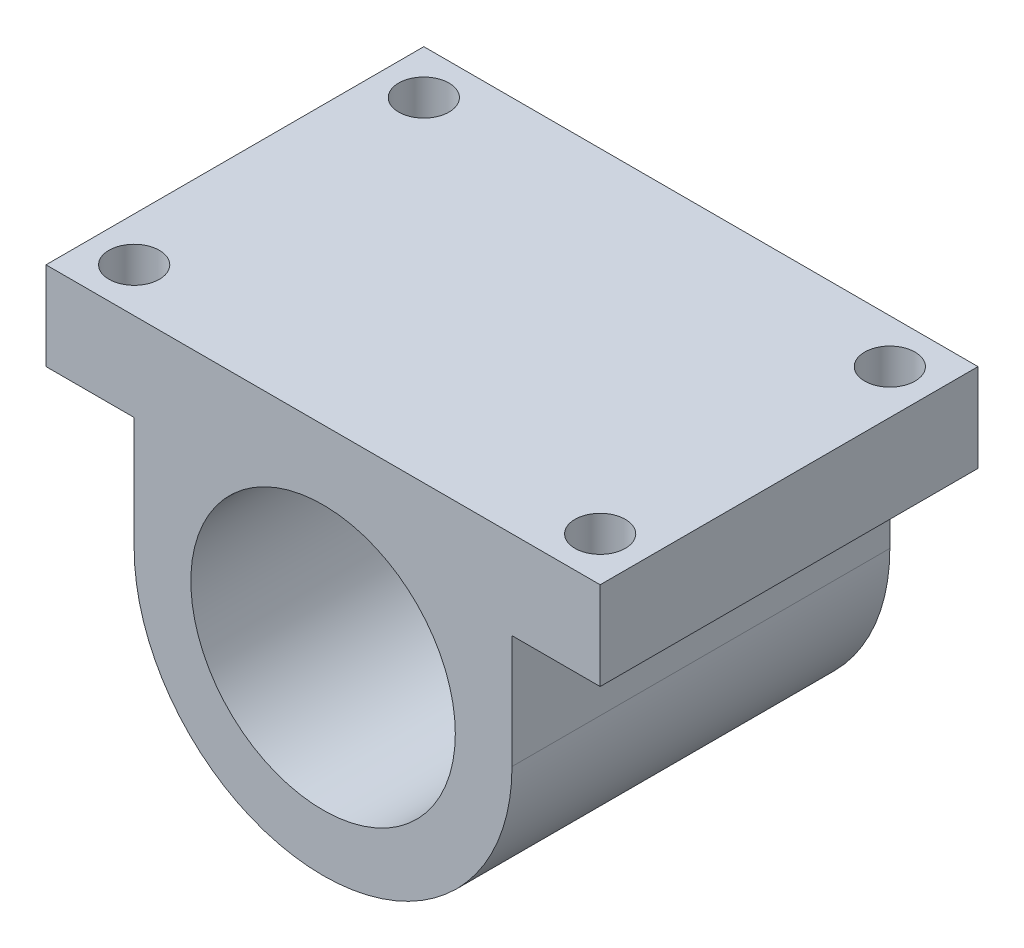
ISO-10303-21;
HEADER;
FILE_DESCRIPTION(('STEP AP214'),'2;1');
FILE_NAME('part.step','',(''),(''),'','','');
FILE_SCHEMA(('AUTOMOTIVE_DESIGN { 1 0 10303 214 1 1 1 1 }'));
ENDSEC;
DATA;
#1=APPLICATION_CONTEXT('core data for automotive mechanical design processes');
#2=APPLICATION_PROTOCOL_DEFINITION('international standard','automotive_design',2000,#1);
#3=PRODUCT_CONTEXT('',#1,'mechanical');
#4=PRODUCT('Part','Part','',(#3));
#5=PRODUCT_RELATED_PRODUCT_CATEGORY('part','',(#4));
#6=PRODUCT_DEFINITION_FORMATION('','',#4);
#7=PRODUCT_DEFINITION_CONTEXT('part definition',#1,'design');
#8=PRODUCT_DEFINITION('design','',#6,#7);
#9=PRODUCT_DEFINITION_SHAPE('','',#8);
#10=(LENGTH_UNIT() NAMED_UNIT(*) SI_UNIT(.MILLI.,.METRE.));
#11=(NAMED_UNIT(*) PLANE_ANGLE_UNIT() SI_UNIT($,.RADIAN.));
#12=(NAMED_UNIT(*) SI_UNIT($,.STERADIAN.) SOLID_ANGLE_UNIT());
#13=UNCERTAINTY_MEASURE_WITH_UNIT(LENGTH_MEASURE(1.E-05),#10,'distance_accuracy_value','');
#14=(GEOMETRIC_REPRESENTATION_CONTEXT(3) GLOBAL_UNCERTAINTY_ASSIGNED_CONTEXT((#13)) GLOBAL_UNIT_ASSIGNED_CONTEXT((#10,
#11,#12)) REPRESENTATION_CONTEXT('',''));
#15=CARTESIAN_POINT('',(0.,0.,0.));
#16=DIRECTION('',(0.,0.,1.));
#17=DIRECTION('',(1.,0.,0.));
#18=AXIS2_PLACEMENT_3D('',#15,#16,#17);
#19=CARTESIAN_POINT('',(-15.,31.,30.));
#20=DIRECTION('',(1.,0.,0.));
#21=DIRECTION('',(0.,0.,-1.));
#22=AXIS2_PLACEMENT_3D('',#19,#20,#21);
#23=PLANE('',#22);
#24=DIRECTION('',(0.,0.,1.));
#25=VECTOR('',#24,1.);
#26=CARTESIAN_POINT('',(-15.,24.,0.));
#27=LINE('',#26,#25);
#28=CARTESIAN_POINT('',(-15.,24.,0.));
#29=VERTEX_POINT('',#28);
#30=CARTESIAN_POINT('',(-15.,24.,30.));
#31=VERTEX_POINT('',#30);
#32=EDGE_CURVE('E53',#29,#31,#27,.T.);
#33=ORIENTED_EDGE('',*,*,#32,.F.);
#34=DIRECTION('',(0.,-1.,0.));
#35=VECTOR('',#34,1.);
#36=CARTESIAN_POINT('',(-15.,31.,0.));
#37=LINE('',#36,#35);
#38=CARTESIAN_POINT('',(-15.,15.,0.));
#39=VERTEX_POINT('',#38);
#40=EDGE_CURVE('E161',#29,#39,#37,.T.);
#41=ORIENTED_EDGE('',*,*,#40,.T.);
#42=DIRECTION('',(0.,0.,-1.));
#43=VECTOR('',#42,1.);
#44=CARTESIAN_POINT('',(-15.,15.,30.));
#45=LINE('',#44,#43);
#46=CARTESIAN_POINT('',(-15.,15.,30.));
#47=VERTEX_POINT('',#46);
#48=EDGE_CURVE('E42',#39,#47,#45,.F.);
#49=ORIENTED_EDGE('',*,*,#48,.T.);
#50=DIRECTION('',(0.,-1.,0.));
#51=VECTOR('',#50,1.);
#52=CARTESIAN_POINT('',(-15.,31.,30.));
#53=LINE('',#52,#51);
#54=EDGE_CURVE('E49',#31,#47,#53,.T.);
#55=ORIENTED_EDGE('',*,*,#54,.F.);
#56=EDGE_LOOP('',(#33,#41,#49,#55));
#57=FACE_BOUND('',#56,.T.);
#58=ADVANCED_FACE('F34',(#57),#23,.F.);
#59=CARTESIAN_POINT('',(15.,0.,30.));
#60=DIRECTION('',(-1.,0.,0.));
#61=DIRECTION('',(0.,0.,1.));
#62=AXIS2_PLACEMENT_3D('',#59,#60,#61);
#63=PLANE('',#62);
#64=DIRECTION('',(0.,0.,-1.));
#65=VECTOR('',#64,1.);
#66=CARTESIAN_POINT('',(15.,24.,0.));
#67=LINE('',#66,#65);
#68=CARTESIAN_POINT('',(15.,24.,30.));
#69=VERTEX_POINT('',#68);
#70=CARTESIAN_POINT('',(15.,24.,0.));
#71=VERTEX_POINT('',#70);
#72=EDGE_CURVE('E142',#69,#71,#67,.T.);
#73=ORIENTED_EDGE('',*,*,#72,.F.);
#74=DIRECTION('',(0.,1.,0.));
#75=VECTOR('',#74,1.);
#76=CARTESIAN_POINT('',(15.,0.,30.));
#77=LINE('',#76,#75);
#78=CARTESIAN_POINT('',(15.,15.,30.));
#79=VERTEX_POINT('',#78);
#80=EDGE_CURVE('E115',#79,#69,#77,.T.);
#81=ORIENTED_EDGE('',*,*,#80,.F.);
#82=DIRECTION('',(0.,0.,-1.));
#83=VECTOR('',#82,1.);
#84=CARTESIAN_POINT('',(15.,15.,30.));
#85=LINE('',#84,#83);
#86=CARTESIAN_POINT('',(15.,15.,0.));
#87=VERTEX_POINT('',#86);
#88=EDGE_CURVE('E114',#79,#87,#85,.T.);
#89=ORIENTED_EDGE('',*,*,#88,.T.);
#90=DIRECTION('',(0.,1.,0.));
#91=VECTOR('',#90,1.);
#92=CARTESIAN_POINT('',(15.,0.,0.));
#93=LINE('',#92,#91);
#94=EDGE_CURVE('E168',#87,#71,#93,.T.);
#95=ORIENTED_EDGE('',*,*,#94,.T.);
#96=EDGE_LOOP('',(#73,#81,#89,#95));
#97=FACE_BOUND('',#96,.T.);
#98=ADVANCED_FACE('F196',(#97),#63,.F.);
#99=CARTESIAN_POINT('',(0.,0.,30.));
#100=DIRECTION('',(0.,0.,1.));
#101=DIRECTION('',(1.,0.,0.));
#102=AXIS2_PLACEMENT_3D('',#99,#100,#101);
#103=PLANE('',#102);
#104=DIRECTION('',(-1.,0.,0.));
#105=VECTOR('',#104,1.);
#106=CARTESIAN_POINT('',(15.,31.,30.));
#107=LINE('',#106,#105);
#108=CARTESIAN_POINT('',(22.,31.,30.));
#109=VERTEX_POINT('',#108);
#110=CARTESIAN_POINT('',(-22.,31.,30.));
#111=VERTEX_POINT('',#110);
#112=EDGE_CURVE('E102',#109,#111,#107,.T.);
#113=ORIENTED_EDGE('',*,*,#112,.T.);
#114=DIRECTION('',(0.,1.,0.));
#115=VECTOR('',#114,1.);
#116=CARTESIAN_POINT('',(-22.,24.,30.));
#117=LINE('',#116,#115);
#118=CARTESIAN_POINT('',(-22.,24.,30.));
#119=VERTEX_POINT('',#118);
#120=EDGE_CURVE('E108',#119,#111,#117,.T.);
#121=ORIENTED_EDGE('',*,*,#120,.F.);
#122=DIRECTION('',(1.,0.,0.));
#123=VECTOR('',#122,1.);
#124=CARTESIAN_POINT('',(-22.,24.,30.));
#125=LINE('',#124,#123);
#126=EDGE_CURVE('E136',#119,#31,#125,.T.);
#127=ORIENTED_EDGE('',*,*,#126,.T.);
#128=ORIENTED_EDGE('',*,*,#54,.T.);
#129=CARTESIAN_POINT('',(0.,15.,30.));
#130=DIRECTION('',(0.,0.,1.));
#131=DIRECTION('',(1.,0.,0.));
#132=AXIS2_PLACEMENT_3D('',#129,#130,#131);
#133=CIRCLE('',#132,15.);
#134=CARTESIAN_POINT('',(0.,0.,30.));
#135=VERTEX_POINT('',#134);
#136=EDGE_CURVE('E11',#47,#135,#133,.T.);
#137=ORIENTED_EDGE('',*,*,#136,.T.);
#138=CARTESIAN_POINT('',(0.,15.,30.));
#139=DIRECTION('',(0.,0.,1.));
#140=DIRECTION('',(1.,0.,0.));
#141=AXIS2_PLACEMENT_3D('',#138,#139,#140);
#142=CIRCLE('',#141,15.);
#143=EDGE_CURVE('E180',#135,#79,#142,.T.);
#144=ORIENTED_EDGE('',*,*,#143,.T.);
#145=ORIENTED_EDGE('',*,*,#80,.T.);
#146=DIRECTION('',(-1.,0.,0.));
#147=VECTOR('',#146,1.);
#148=CARTESIAN_POINT('',(22.,24.,30.));
#149=LINE('',#148,#147);
#150=CARTESIAN_POINT('',(22.,24.,30.));
#151=VERTEX_POINT('',#150);
#152=EDGE_CURVE('E155',#151,#69,#149,.T.);
#153=ORIENTED_EDGE('',*,*,#152,.F.);
#154=DIRECTION('',(0.,-1.,0.));
#155=VECTOR('',#154,1.);
#156=CARTESIAN_POINT('',(22.,24.,30.));
#157=LINE('',#156,#155);
#158=EDGE_CURVE('E110',#109,#151,#157,.T.);
#159=ORIENTED_EDGE('',*,*,#158,.F.);
#160=EDGE_LOOP('',(#113,#121,#127,#128,#137,#144,#145,#153,#159));
#161=FACE_BOUND('',#160,.T.);
#162=CARTESIAN_POINT('',(0.,15.,30.));
#163=DIRECTION('',(0.,0.,1.));
#164=DIRECTION('',(1.,0.,0.));
#165=AXIS2_PLACEMENT_3D('',#162,#163,#164);
#166=CIRCLE('',#165,10.5);
#167=CARTESIAN_POINT('',(10.5,15.,30.));
#168=VERTEX_POINT('',#167);
#169=EDGE_CURVE('E158',#168,#168,#166,.T.);
#170=ORIENTED_EDGE('',*,*,#169,.F.);
#171=EDGE_LOOP('',(#170));
#172=FACE_BOUND('',#171,.T.);
#173=ADVANCED_FACE('F104',(#161,#172),#103,.T.);
#174=CARTESIAN_POINT('',(0.,0.,0.));
#175=DIRECTION('',(0.,0.,1.));
#176=DIRECTION('',(1.,0.,0.));
#177=AXIS2_PLACEMENT_3D('',#174,#175,#176);
#178=PLANE('',#177);
#179=CARTESIAN_POINT('',(0.,15.,0.));
#180=DIRECTION('',(0.,0.,1.));
#181=DIRECTION('',(1.,0.,0.));
#182=AXIS2_PLACEMENT_3D('',#179,#180,#181);
#183=CIRCLE('',#182,15.);
#184=CARTESIAN_POINT('',(0.,0.,0.));
#185=VERTEX_POINT('',#184);
#186=EDGE_CURVE('E174',#87,#185,#183,.F.);
#187=ORIENTED_EDGE('',*,*,#186,.T.);
#188=CARTESIAN_POINT('',(0.,15.,0.));
#189=DIRECTION('',(0.,0.,1.));
#190=DIRECTION('',(1.,0.,0.));
#191=AXIS2_PLACEMENT_3D('',#188,#189,#190);
#192=CIRCLE('',#191,15.);
#193=EDGE_CURVE('E182',#185,#39,#192,.F.);
#194=ORIENTED_EDGE('',*,*,#193,.T.);
#195=ORIENTED_EDGE('',*,*,#40,.F.);
#196=DIRECTION('',(1.,0.,0.));
#197=VECTOR('',#196,1.);
#198=CARTESIAN_POINT('',(-22.,24.,0.));
#199=LINE('',#198,#197);
#200=CARTESIAN_POINT('',(-22.,24.,0.));
#201=VERTEX_POINT('',#200);
#202=EDGE_CURVE('E139',#201,#29,#199,.T.);
#203=ORIENTED_EDGE('',*,*,#202,.F.);
#204=DIRECTION('',(0.,-1.,0.));
#205=VECTOR('',#204,1.);
#206=CARTESIAN_POINT('',(-22.,31.,0.));
#207=LINE('',#206,#205);
#208=CARTESIAN_POINT('',(-22.,31.,0.));
#209=VERTEX_POINT('',#208);
#210=EDGE_CURVE('E123',#209,#201,#207,.T.);
#211=ORIENTED_EDGE('',*,*,#210,.F.);
#212=DIRECTION('',(-1.,0.,0.));
#213=VECTOR('',#212,1.);
#214=CARTESIAN_POINT('',(15.,31.,0.));
#215=LINE('',#214,#213);
#216=CARTESIAN_POINT('',(22.,31.,0.));
#217=VERTEX_POINT('',#216);
#218=EDGE_CURVE('E120',#217,#209,#215,.T.);
#219=ORIENTED_EDGE('',*,*,#218,.F.);
#220=DIRECTION('',(0.,1.,0.));
#221=VECTOR('',#220,1.);
#222=CARTESIAN_POINT('',(22.,31.,0.));
#223=LINE('',#222,#221);
#224=CARTESIAN_POINT('',(22.,24.,0.));
#225=VERTEX_POINT('',#224);
#226=EDGE_CURVE('E148',#225,#217,#223,.T.);
#227=ORIENTED_EDGE('',*,*,#226,.F.);
#228=DIRECTION('',(-1.,0.,0.));
#229=VECTOR('',#228,1.);
#230=CARTESIAN_POINT('',(22.,24.,0.));
#231=LINE('',#230,#229);
#232=EDGE_CURVE('E151',#225,#71,#231,.T.);
#233=ORIENTED_EDGE('',*,*,#232,.T.);
#234=ORIENTED_EDGE('',*,*,#94,.F.);
#235=EDGE_LOOP('',(#187,#194,#195,#203,#211,#219,#227,#233,#234));
#236=FACE_BOUND('',#235,.T.);
#237=CARTESIAN_POINT('',(0.,15.,0.));
#238=DIRECTION('',(0.,0.,1.));
#239=DIRECTION('',(1.,0.,0.));
#240=AXIS2_PLACEMENT_3D('',#237,#238,#239);
#241=CIRCLE('',#240,10.5);
#242=CARTESIAN_POINT('',(10.5,15.,0.));
#243=VERTEX_POINT('',#242);
#244=EDGE_CURVE('E157',#243,#243,#241,.T.);
#245=ORIENTED_EDGE('',*,*,#244,.T.);
#246=EDGE_LOOP('',(#245));
#247=FACE_BOUND('',#246,.T.);
#248=ADVANCED_FACE('F198',(#236,#247),#178,.F.);
#249=CARTESIAN_POINT('',(15.,31.,30.));
#250=DIRECTION('',(0.,-1.,0.));
#251=DIRECTION('',(0.,0.,-1.));
#252=AXIS2_PLACEMENT_3D('',#249,#250,#251);
#253=PLANE('',#252);
#254=CARTESIAN_POINT('',(18.5,31.,26.5));
#255=DIRECTION('',(0.,1.,0.));
#256=DIRECTION('',(0.,0.,1.));
#257=AXIS2_PLACEMENT_3D('',#254,#255,#256);
#258=CIRCLE('',#257,2.);
#259=CARTESIAN_POINT('',(18.5,31.,28.5));
#260=VERTEX_POINT('',#259);
#261=EDGE_CURVE('E320',#260,#260,#258,.T.);
#262=ORIENTED_EDGE('',*,*,#261,.F.);
#263=EDGE_LOOP('',(#262));
#264=FACE_BOUND('',#263,.T.);
#265=CARTESIAN_POINT('',(-18.5,31.,26.5));
#266=DIRECTION('',(0.,1.,0.));
#267=DIRECTION('',(0.,0.,1.));
#268=AXIS2_PLACEMENT_3D('',#265,#266,#267);
#269=CIRCLE('',#268,2.);
#270=CARTESIAN_POINT('',(-18.5,31.,28.5));
#271=VERTEX_POINT('',#270);
#272=EDGE_CURVE('E326',#271,#271,#269,.T.);
#273=ORIENTED_EDGE('',*,*,#272,.F.);
#274=EDGE_LOOP('',(#273));
#275=FACE_BOUND('',#274,.T.);
#276=CARTESIAN_POINT('',(-18.5,31.,3.5));
#277=DIRECTION('',(0.,1.,0.));
#278=DIRECTION('',(0.,0.,1.));
#279=AXIS2_PLACEMENT_3D('',#276,#277,#278);
#280=CIRCLE('',#279,2.);
#281=CARTESIAN_POINT('',(-18.5,31.,5.5));
#282=VERTEX_POINT('',#281);
#283=EDGE_CURVE('E332',#282,#282,#280,.T.);
#284=ORIENTED_EDGE('',*,*,#283,.F.);
#285=EDGE_LOOP('',(#284));
#286=FACE_BOUND('',#285,.T.);
#287=CARTESIAN_POINT('',(18.5,31.,3.5));
#288=DIRECTION('',(0.,1.,0.));
#289=DIRECTION('',(0.,0.,1.));
#290=AXIS2_PLACEMENT_3D('',#287,#288,#289);
#291=CIRCLE('',#290,2.);
#292=CARTESIAN_POINT('',(18.5,31.,5.50000000000001));
#293=VERTEX_POINT('',#292);
#294=EDGE_CURVE('E323',#293,#293,#291,.T.);
#295=ORIENTED_EDGE('',*,*,#294,.F.);
#296=EDGE_LOOP('',(#295));
#297=FACE_BOUND('',#296,.T.);
#298=ORIENTED_EDGE('',*,*,#218,.T.);
#299=DIRECTION('',(0.,0.,-1.));
#300=VECTOR('',#299,1.);
#301=CARTESIAN_POINT('',(-22.,31.,30.));
#302=LINE('',#301,#300);
#303=EDGE_CURVE('E118',#111,#209,#302,.T.);
#304=ORIENTED_EDGE('',*,*,#303,.F.);
#305=ORIENTED_EDGE('',*,*,#112,.F.);
#306=DIRECTION('',(0.,0.,1.));
#307=VECTOR('',#306,1.);
#308=CARTESIAN_POINT('',(22.,31.,30.));
#309=LINE('',#308,#307);
#310=EDGE_CURVE('E143',#217,#109,#309,.T.);
#311=ORIENTED_EDGE('',*,*,#310,.F.);
#312=EDGE_LOOP('',(#298,#304,#305,#311));
#313=FACE_BOUND('',#312,.T.);
#314=ADVANCED_FACE('F119',(#264,#275,#286,#297,#313),#253,.F.);
#315=CARTESIAN_POINT('',(0.,15.,30.));
#316=DIRECTION('',(0.,0.,-1.));
#317=DIRECTION('',(-1.,0.,0.));
#318=AXIS2_PLACEMENT_3D('',#315,#316,#317);
#319=CYLINDRICAL_SURFACE('',#318,10.5);
#320=ORIENTED_EDGE('',*,*,#169,.T.);
#321=EDGE_LOOP('',(#320));
#322=FACE_BOUND('',#321,.T.);
#323=ORIENTED_EDGE('',*,*,#244,.F.);
#324=EDGE_LOOP('',(#323));
#325=FACE_BOUND('',#324,.T.);
#326=ADVANCED_FACE('F226',(#322,#325),#319,.F.);
#327=CARTESIAN_POINT('',(0.,15.,30.));
#328=DIRECTION('',(0.,0.,-1.));
#329=DIRECTION('',(-1.,0.,0.));
#330=AXIS2_PLACEMENT_3D('',#327,#328,#329);
#331=CYLINDRICAL_SURFACE('',#330,15.);
#332=ORIENTED_EDGE('',*,*,#143,.F.);
#333=DIRECTION('',(0.,0.,-1.));
#334=VECTOR('',#333,1.);
#335=CARTESIAN_POINT('',(0.,0.,30.));
#336=LINE('',#335,#334);
#337=EDGE_CURVE('E177',#185,#135,#336,.F.);
#338=ORIENTED_EDGE('',*,*,#337,.F.);
#339=ORIENTED_EDGE('',*,*,#186,.F.);
#340=ORIENTED_EDGE('',*,*,#88,.F.);
#341=EDGE_LOOP('',(#332,#338,#339,#340));
#342=FACE_BOUND('',#341,.T.);
#343=ADVANCED_FACE('F192',(#342),#331,.T.);
#344=CARTESIAN_POINT('',(0.,15.,30.));
#345=DIRECTION('',(0.,0.,-1.));
#346=DIRECTION('',(-1.,0.,0.));
#347=AXIS2_PLACEMENT_3D('',#344,#345,#346);
#348=CYLINDRICAL_SURFACE('',#347,15.);
#349=ORIENTED_EDGE('',*,*,#136,.F.);
#350=ORIENTED_EDGE('',*,*,#48,.F.);
#351=ORIENTED_EDGE('',*,*,#193,.F.);
#352=ORIENTED_EDGE('',*,*,#337,.T.);
#353=EDGE_LOOP('',(#349,#350,#351,#352));
#354=FACE_BOUND('',#353,.T.);
#355=ADVANCED_FACE('F36',(#354),#348,.T.);
#356=CARTESIAN_POINT('',(22.,24.,0.));
#357=DIRECTION('',(0.,1.,0.));
#358=DIRECTION('',(0.,0.,1.));
#359=AXIS2_PLACEMENT_3D('',#356,#357,#358);
#360=PLANE('',#359);
#361=CARTESIAN_POINT('',(18.5,24.,26.5));
#362=DIRECTION('',(0.,1.,0.));
#363=DIRECTION('',(0.,0.,1.));
#364=AXIS2_PLACEMENT_3D('',#361,#362,#363);
#365=CIRCLE('',#364,2.);
#366=CARTESIAN_POINT('',(18.5,24.,28.5));
#367=VERTEX_POINT('',#366);
#368=EDGE_CURVE('E317',#367,#367,#365,.F.);
#369=ORIENTED_EDGE('',*,*,#368,.F.);
#370=EDGE_LOOP('',(#369));
#371=FACE_BOUND('',#370,.T.);
#372=CARTESIAN_POINT('',(18.5,24.,3.5));
#373=DIRECTION('',(0.,1.,0.));
#374=DIRECTION('',(0.,0.,1.));
#375=AXIS2_PLACEMENT_3D('',#372,#373,#374);
#376=CIRCLE('',#375,2.);
#377=CARTESIAN_POINT('',(18.5,24.,5.50000000000001));
#378=VERTEX_POINT('',#377);
#379=EDGE_CURVE('E130',#378,#378,#376,.F.);
#380=ORIENTED_EDGE('',*,*,#379,.F.);
#381=EDGE_LOOP('',(#380));
#382=FACE_BOUND('',#381,.T.);
#383=ORIENTED_EDGE('',*,*,#72,.T.);
#384=ORIENTED_EDGE('',*,*,#232,.F.);
#385=DIRECTION('',(0.,0.,-1.));
#386=VECTOR('',#385,1.);
#387=CARTESIAN_POINT('',(22.,24.,0.));
#388=LINE('',#387,#386);
#389=EDGE_CURVE('E146',#151,#225,#388,.T.);
#390=ORIENTED_EDGE('',*,*,#389,.F.);
#391=ORIENTED_EDGE('',*,*,#152,.T.);
#392=EDGE_LOOP('',(#383,#384,#390,#391));
#393=FACE_BOUND('',#392,.T.);
#394=ADVANCED_FACE('F204',(#371,#382,#393),#360,.F.);
#395=CARTESIAN_POINT('',(22.,0.,0.));
#396=DIRECTION('',(-1.,0.,0.));
#397=DIRECTION('',(0.,0.,1.));
#398=AXIS2_PLACEMENT_3D('',#395,#396,#397);
#399=PLANE('',#398);
#400=ORIENTED_EDGE('',*,*,#310,.T.);
#401=ORIENTED_EDGE('',*,*,#158,.T.);
#402=ORIENTED_EDGE('',*,*,#389,.T.);
#403=ORIENTED_EDGE('',*,*,#226,.T.);
#404=EDGE_LOOP('',(#400,#401,#402,#403));
#405=FACE_BOUND('',#404,.T.);
#406=ADVANCED_FACE('F206',(#405),#399,.F.);
#407=CARTESIAN_POINT('',(-22.,24.,0.));
#408=DIRECTION('',(0.,1.,0.));
#409=DIRECTION('',(0.,0.,1.));
#410=AXIS2_PLACEMENT_3D('',#407,#408,#409);
#411=PLANE('',#410);
#412=CARTESIAN_POINT('',(-18.5,24.,26.5));
#413=DIRECTION('',(0.,1.,0.));
#414=DIRECTION('',(0.,0.,1.));
#415=AXIS2_PLACEMENT_3D('',#412,#413,#414);
#416=CIRCLE('',#415,2.);
#417=CARTESIAN_POINT('',(-18.5,24.,28.5));
#418=VERTEX_POINT('',#417);
#419=EDGE_CURVE('E321',#418,#418,#416,.F.);
#420=ORIENTED_EDGE('',*,*,#419,.F.);
#421=EDGE_LOOP('',(#420));
#422=FACE_BOUND('',#421,.T.);
#423=CARTESIAN_POINT('',(-18.5,24.,3.5));
#424=DIRECTION('',(0.,1.,0.));
#425=DIRECTION('',(0.,0.,1.));
#426=AXIS2_PLACEMENT_3D('',#423,#424,#425);
#427=CIRCLE('',#426,2.);
#428=CARTESIAN_POINT('',(-18.5,24.,5.5));
#429=VERTEX_POINT('',#428);
#430=EDGE_CURVE('E330',#429,#429,#427,.F.);
#431=ORIENTED_EDGE('',*,*,#430,.F.);
#432=EDGE_LOOP('',(#431));
#433=FACE_BOUND('',#432,.T.);
#434=ORIENTED_EDGE('',*,*,#32,.T.);
#435=ORIENTED_EDGE('',*,*,#126,.F.);
#436=DIRECTION('',(0.,0.,1.));
#437=VECTOR('',#436,1.);
#438=CARTESIAN_POINT('',(-22.,24.,0.));
#439=LINE('',#438,#437);
#440=EDGE_CURVE('E127',#201,#119,#439,.T.);
#441=ORIENTED_EDGE('',*,*,#440,.F.);
#442=ORIENTED_EDGE('',*,*,#202,.T.);
#443=EDGE_LOOP('',(#434,#435,#441,#442));
#444=FACE_BOUND('',#443,.T.);
#445=ADVANCED_FACE('F208',(#422,#433,#444),#411,.F.);
#446=CARTESIAN_POINT('',(-22.,0.,0.));
#447=DIRECTION('',(-1.,0.,0.));
#448=DIRECTION('',(0.,0.,1.));
#449=AXIS2_PLACEMENT_3D('',#446,#447,#448);
#450=PLANE('',#449);
#451=ORIENTED_EDGE('',*,*,#120,.T.);
#452=ORIENTED_EDGE('',*,*,#303,.T.);
#453=ORIENTED_EDGE('',*,*,#210,.T.);
#454=ORIENTED_EDGE('',*,*,#440,.T.);
#455=EDGE_LOOP('',(#451,#452,#453,#454));
#456=FACE_BOUND('',#455,.T.);
#457=ADVANCED_FACE('F125',(#456),#450,.T.);
#458=CARTESIAN_POINT('',(18.5,18.3431457505076,3.5));
#459=DIRECTION('',(0.,1.,0.));
#460=DIRECTION('',(0.,0.,1.));
#461=AXIS2_PLACEMENT_3D('',#458,#459,#460);
#462=CYLINDRICAL_SURFACE('',#461,2.);
#463=ORIENTED_EDGE('',*,*,#379,.T.);
#464=EDGE_LOOP('',(#463));
#465=FACE_BOUND('',#464,.T.);
#466=ORIENTED_EDGE('',*,*,#294,.T.);
#467=EDGE_LOOP('',(#466));
#468=FACE_BOUND('',#467,.T.);
#469=ADVANCED_FACE('F273',(#465,#468),#462,.F.);
#470=CARTESIAN_POINT('',(-18.5,18.3431457505076,3.5));
#471=DIRECTION('',(0.,1.,0.));
#472=DIRECTION('',(0.,0.,1.));
#473=AXIS2_PLACEMENT_3D('',#470,#471,#472);
#474=CYLINDRICAL_SURFACE('',#473,2.);
#475=ORIENTED_EDGE('',*,*,#430,.T.);
#476=EDGE_LOOP('',(#475));
#477=FACE_BOUND('',#476,.T.);
#478=ORIENTED_EDGE('',*,*,#283,.T.);
#479=EDGE_LOOP('',(#478));
#480=FACE_BOUND('',#479,.T.);
#481=ADVANCED_FACE('F278',(#477,#480),#474,.F.);
#482=CARTESIAN_POINT('',(-18.5,18.3431457505076,26.5));
#483=DIRECTION('',(0.,1.,0.));
#484=DIRECTION('',(0.,0.,1.));
#485=AXIS2_PLACEMENT_3D('',#482,#483,#484);
#486=CYLINDRICAL_SURFACE('',#485,2.);
#487=ORIENTED_EDGE('',*,*,#419,.T.);
#488=EDGE_LOOP('',(#487));
#489=FACE_BOUND('',#488,.T.);
#490=ORIENTED_EDGE('',*,*,#272,.T.);
#491=EDGE_LOOP('',(#490));
#492=FACE_BOUND('',#491,.T.);
#493=ADVANCED_FACE('F288',(#489,#492),#486,.F.);
#494=CARTESIAN_POINT('',(18.5,18.3431457505076,26.5));
#495=DIRECTION('',(0.,1.,0.));
#496=DIRECTION('',(0.,0.,1.));
#497=AXIS2_PLACEMENT_3D('',#494,#495,#496);
#498=CYLINDRICAL_SURFACE('',#497,2.);
#499=ORIENTED_EDGE('',*,*,#368,.T.);
#500=EDGE_LOOP('',(#499));
#501=FACE_BOUND('',#500,.T.);
#502=ORIENTED_EDGE('',*,*,#261,.T.);
#503=EDGE_LOOP('',(#502));
#504=FACE_BOUND('',#503,.T.);
#505=ADVANCED_FACE('F298',(#501,#504),#498,.F.);
#506=CLOSED_SHELL('',(#58,#98,#173,#248,#314,#326,#343,#355,#394,#406,#445,#457,#469,#481,#493,#505));
#507=MANIFOLD_SOLID_BREP('B2',#506);
#508=ADVANCED_BREP_SHAPE_REPRESENTATION('',(#18,#507),#14);
#509=SHAPE_DEFINITION_REPRESENTATION(#9,#508);
ENDSEC;
END-ISO-10303-21;
